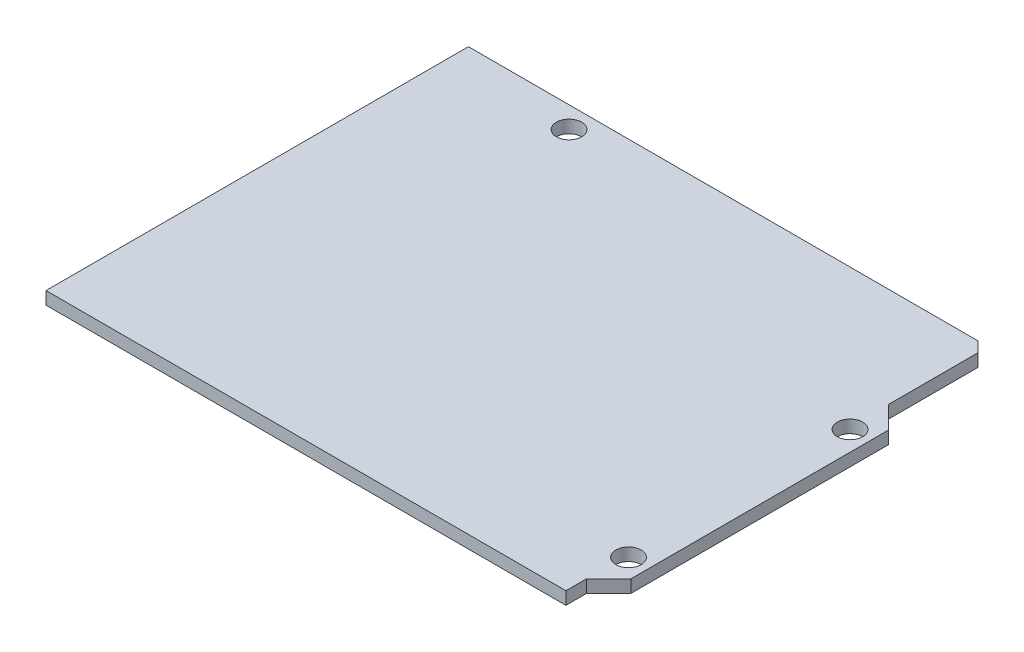
ISO-10303-21;
HEADER;
FILE_DESCRIPTION(('STEP AP214'),'2;1');
FILE_NAME('part.step','',(''),(''),'','','');
FILE_SCHEMA(('AUTOMOTIVE_DESIGN { 1 0 10303 214 1 1 1 1 }'));
ENDSEC;
DATA;
#1=APPLICATION_CONTEXT('core data for automotive mechanical design processes');
#2=APPLICATION_PROTOCOL_DEFINITION('international standard','automotive_design',2000,#1);
#3=PRODUCT_CONTEXT('',#1,'mechanical');
#4=PRODUCT('Part','Part','',(#3));
#5=PRODUCT_RELATED_PRODUCT_CATEGORY('part','',(#4));
#6=PRODUCT_DEFINITION_FORMATION('','',#4);
#7=PRODUCT_DEFINITION_CONTEXT('part definition',#1,'design');
#8=PRODUCT_DEFINITION('design','',#6,#7);
#9=PRODUCT_DEFINITION_SHAPE('','',#8);
#10=(LENGTH_UNIT() NAMED_UNIT(*) SI_UNIT(.MILLI.,.METRE.));
#11=(NAMED_UNIT(*) PLANE_ANGLE_UNIT() SI_UNIT($,.RADIAN.));
#12=(NAMED_UNIT(*) SI_UNIT($,.STERADIAN.) SOLID_ANGLE_UNIT());
#13=UNCERTAINTY_MEASURE_WITH_UNIT(LENGTH_MEASURE(1.E-05),#10,'distance_accuracy_value','');
#14=(GEOMETRIC_REPRESENTATION_CONTEXT(3) GLOBAL_UNCERTAINTY_ASSIGNED_CONTEXT((#13)) GLOBAL_UNIT_ASSIGNED_CONTEXT((#10,
#11,#12)) REPRESENTATION_CONTEXT('',''));
#15=CARTESIAN_POINT('',(0.,0.,0.));
#16=DIRECTION('',(0.,0.,1.));
#17=DIRECTION('',(1.,0.,0.));
#18=AXIS2_PLACEMENT_3D('',#15,#16,#17);
#19=CARTESIAN_POINT('',(0.,1.6,0.));
#20=DIRECTION('',(0.,-1.,0.));
#21=DIRECTION('',(0.,0.,-1.));
#22=AXIS2_PLACEMENT_3D('',#19,#20,#21);
#23=PLANE('',#22);
#24=DIRECTION('',(0.,0.,1.));
#25=VECTOR('',#24,1.);
#26=CARTESIAN_POINT('',(0.,1.6,0.));
#27=LINE('',#26,#25);
#28=CARTESIAN_POINT('',(0.,1.6,-53.3));
#29=VERTEX_POINT('',#28);
#30=CARTESIAN_POINT('',(0.,1.6,0.));
#31=VERTEX_POINT('',#30);
#32=EDGE_CURVE('E164',#29,#31,#27,.T.);
#33=ORIENTED_EDGE('',*,*,#32,.T.);
#34=DIRECTION('',(1.,0.,0.));
#35=VECTOR('',#34,1.);
#36=CARTESIAN_POINT('',(0.,1.6,0.));
#37=LINE('',#36,#35);
#38=CARTESIAN_POINT('',(65.6,1.6,0.));
#39=VERTEX_POINT('',#38);
#40=EDGE_CURVE('E103',#31,#39,#37,.T.);
#41=ORIENTED_EDGE('',*,*,#40,.T.);
#42=DIRECTION('',(0.,0.,-1.));
#43=VECTOR('',#42,1.);
#44=CARTESIAN_POINT('',(65.6,1.6,0.));
#45=LINE('',#44,#43);
#46=CARTESIAN_POINT('',(65.6,1.6,-2.6));
#47=VERTEX_POINT('',#46);
#48=EDGE_CURVE('E183',#39,#47,#45,.T.);
#49=ORIENTED_EDGE('',*,*,#48,.T.);
#50=DIRECTION('',(0.707106781186549,0.,-0.707106781186546));
#51=VECTOR('',#50,1.);
#52=CARTESIAN_POINT('',(65.6,1.6,-2.6));
#53=LINE('',#52,#51);
#54=CARTESIAN_POINT('',(68.4,1.6,-5.39999999999999));
#55=VERTEX_POINT('',#54);
#56=EDGE_CURVE('E201',#47,#55,#53,.T.);
#57=ORIENTED_EDGE('',*,*,#56,.T.);
#58=DIRECTION('',(0.,0.,-1.));
#59=VECTOR('',#58,1.);
#60=CARTESIAN_POINT('',(68.4,1.6,-5.39999999999999));
#61=LINE('',#60,#59);
#62=CARTESIAN_POINT('',(68.4,1.6,-37.9));
#63=VERTEX_POINT('',#62);
#64=EDGE_CURVE('E199',#55,#63,#61,.T.);
#65=ORIENTED_EDGE('',*,*,#64,.T.);
#66=DIRECTION('',(-0.707106781186551,0.,-0.707106781186544));
#67=VECTOR('',#66,1.);
#68=CARTESIAN_POINT('',(68.4,1.6,-37.9));
#69=LINE('',#68,#67);
#70=CARTESIAN_POINT('',(65.6,1.6,-40.7));
#71=VERTEX_POINT('',#70);
#72=EDGE_CURVE('E125',#63,#71,#69,.T.);
#73=ORIENTED_EDGE('',*,*,#72,.T.);
#74=DIRECTION('',(0.,0.,-1.));
#75=VECTOR('',#74,1.);
#76=CARTESIAN_POINT('',(65.6,1.6,-40.7));
#77=LINE('',#76,#75);
#78=CARTESIAN_POINT('',(65.6,1.6,-52.));
#79=VERTEX_POINT('',#78);
#80=EDGE_CURVE('E119',#71,#79,#77,.T.);
#81=ORIENTED_EDGE('',*,*,#80,.T.);
#82=DIRECTION('',(-0.707106781186551,0.,-0.707106781186544));
#83=VECTOR('',#82,1.);
#84=CARTESIAN_POINT('',(65.6,1.6,-52.));
#85=LINE('',#84,#83);
#86=CARTESIAN_POINT('',(64.3,1.6,-53.3));
#87=VERTEX_POINT('',#86);
#88=EDGE_CURVE('E123',#79,#87,#85,.T.);
#89=ORIENTED_EDGE('',*,*,#88,.T.);
#90=DIRECTION('',(-1.,0.,0.));
#91=VECTOR('',#90,1.);
#92=CARTESIAN_POINT('',(0.,1.6,-53.3));
#93=LINE('',#92,#91);
#94=EDGE_CURVE('E57',#87,#29,#93,.T.);
#95=ORIENTED_EDGE('',*,*,#94,.T.);
#96=EDGE_LOOP('',(#33,#41,#49,#57,#65,#73,#81,#89,#95));
#97=FACE_BOUND('',#96,.T.);
#98=CARTESIAN_POINT('',(65.9,1.6,-7.6));
#99=DIRECTION('',(0.,1.,0.));
#100=DIRECTION('',(0.,0.,1.));
#101=AXIS2_PLACEMENT_3D('',#98,#99,#100);
#102=CIRCLE('',#101,1.60000000000001);
#103=CARTESIAN_POINT('',(65.9,1.6,-5.99999999999999));
#104=VERTEX_POINT('',#103);
#105=EDGE_CURVE('E149',#104,#104,#102,.T.);
#106=ORIENTED_EDGE('',*,*,#105,.F.);
#107=EDGE_LOOP('',(#106));
#108=FACE_BOUND('',#107,.T.);
#109=CARTESIAN_POINT('',(65.9,1.6,-35.55));
#110=DIRECTION('',(0.,1.,0.));
#111=DIRECTION('',(0.,0.,1.));
#112=AXIS2_PLACEMENT_3D('',#109,#110,#111);
#113=CIRCLE('',#112,1.60000000000001);
#114=CARTESIAN_POINT('',(65.9,1.6,-33.95));
#115=VERTEX_POINT('',#114);
#116=EDGE_CURVE('E212',#115,#115,#113,.T.);
#117=ORIENTED_EDGE('',*,*,#116,.F.);
#118=EDGE_LOOP('',(#117));
#119=FACE_BOUND('',#118,.T.);
#120=CARTESIAN_POINT('',(15.4,1.6,-50.6));
#121=DIRECTION('',(0.,1.,0.));
#122=DIRECTION('',(0.,0.,1.));
#123=AXIS2_PLACEMENT_3D('',#120,#121,#122);
#124=CIRCLE('',#123,1.6);
#125=CARTESIAN_POINT('',(15.4,1.6,-49.));
#126=VERTEX_POINT('',#125);
#127=EDGE_CURVE('E219',#126,#126,#124,.T.);
#128=ORIENTED_EDGE('',*,*,#127,.F.);
#129=EDGE_LOOP('',(#128));
#130=FACE_BOUND('',#129,.T.);
#131=ADVANCED_FACE('F38',(#97,#108,#119,#130),#23,.F.);
#132=CARTESIAN_POINT('',(0.,0.,0.));
#133=DIRECTION('',(0.,-1.,0.));
#134=DIRECTION('',(0.,0.,-1.));
#135=AXIS2_PLACEMENT_3D('',#132,#133,#134);
#136=PLANE('',#135);
#137=CARTESIAN_POINT('',(65.9,0.,-35.55));
#138=DIRECTION('',(0.,1.,0.));
#139=DIRECTION('',(0.,0.,1.));
#140=AXIS2_PLACEMENT_3D('',#137,#138,#139);
#141=CIRCLE('',#140,1.60000000000001);
#142=CARTESIAN_POINT('',(65.9,0.,-33.95));
#143=VERTEX_POINT('',#142);
#144=EDGE_CURVE('E215',#143,#143,#141,.T.);
#145=ORIENTED_EDGE('',*,*,#144,.T.);
#146=EDGE_LOOP('',(#145));
#147=FACE_BOUND('',#146,.T.);
#148=DIRECTION('',(0.,0.,1.));
#149=VECTOR('',#148,1.);
#150=CARTESIAN_POINT('',(0.,0.,0.));
#151=LINE('',#150,#149);
#152=CARTESIAN_POINT('',(0.,0.,-53.3));
#153=VERTEX_POINT('',#152);
#154=CARTESIAN_POINT('',(0.,0.,0.));
#155=VERTEX_POINT('',#154);
#156=EDGE_CURVE('E144',#153,#155,#151,.T.);
#157=ORIENTED_EDGE('',*,*,#156,.F.);
#158=DIRECTION('',(-1.,0.,0.));
#159=VECTOR('',#158,1.);
#160=CARTESIAN_POINT('',(0.,0.,-53.3));
#161=LINE('',#160,#159);
#162=CARTESIAN_POINT('',(64.3,0.,-53.3));
#163=VERTEX_POINT('',#162);
#164=EDGE_CURVE('E95',#163,#153,#161,.T.);
#165=ORIENTED_EDGE('',*,*,#164,.F.);
#166=DIRECTION('',(-0.707106781186551,0.,-0.707106781186544));
#167=VECTOR('',#166,1.);
#168=CARTESIAN_POINT('',(65.6,0.,-52.));
#169=LINE('',#168,#167);
#170=CARTESIAN_POINT('',(65.6,0.,-52.));
#171=VERTEX_POINT('',#170);
#172=EDGE_CURVE('E89',#171,#163,#169,.T.);
#173=ORIENTED_EDGE('',*,*,#172,.F.);
#174=DIRECTION('',(0.,0.,-1.));
#175=VECTOR('',#174,1.);
#176=CARTESIAN_POINT('',(65.6,0.,-40.7));
#177=LINE('',#176,#175);
#178=CARTESIAN_POINT('',(65.6,0.,-40.7));
#179=VERTEX_POINT('',#178);
#180=EDGE_CURVE('E133',#179,#171,#177,.T.);
#181=ORIENTED_EDGE('',*,*,#180,.F.);
#182=DIRECTION('',(-0.707106781186551,0.,-0.707106781186544));
#183=VECTOR('',#182,1.);
#184=CARTESIAN_POINT('',(68.4,0.,-37.9));
#185=LINE('',#184,#183);
#186=CARTESIAN_POINT('',(68.4,0.,-37.9));
#187=VERTEX_POINT('',#186);
#188=EDGE_CURVE('E158',#187,#179,#185,.T.);
#189=ORIENTED_EDGE('',*,*,#188,.F.);
#190=DIRECTION('',(0.,0.,-1.));
#191=VECTOR('',#190,1.);
#192=CARTESIAN_POINT('',(68.4,0.,-5.39999999999999));
#193=LINE('',#192,#191);
#194=CARTESIAN_POINT('',(68.4,0.,-5.39999999999999));
#195=VERTEX_POINT('',#194);
#196=EDGE_CURVE('E155',#195,#187,#193,.T.);
#197=ORIENTED_EDGE('',*,*,#196,.F.);
#198=DIRECTION('',(0.707106781186549,0.,-0.707106781186546));
#199=VECTOR('',#198,1.);
#200=CARTESIAN_POINT('',(65.6,0.,-2.6));
#201=LINE('',#200,#199);
#202=CARTESIAN_POINT('',(65.6,0.,-2.6));
#203=VERTEX_POINT('',#202);
#204=EDGE_CURVE('E153',#203,#195,#201,.T.);
#205=ORIENTED_EDGE('',*,*,#204,.F.);
#206=DIRECTION('',(0.,0.,-1.));
#207=VECTOR('',#206,1.);
#208=CARTESIAN_POINT('',(65.6,0.,0.));
#209=LINE('',#208,#207);
#210=CARTESIAN_POINT('',(65.6,0.,0.));
#211=VERTEX_POINT('',#210);
#212=EDGE_CURVE('E151',#211,#203,#209,.T.);
#213=ORIENTED_EDGE('',*,*,#212,.F.);
#214=DIRECTION('',(1.,0.,0.));
#215=VECTOR('',#214,1.);
#216=CARTESIAN_POINT('',(0.,0.,0.));
#217=LINE('',#216,#215);
#218=EDGE_CURVE('E148',#155,#211,#217,.T.);
#219=ORIENTED_EDGE('',*,*,#218,.F.);
#220=EDGE_LOOP('',(#157,#165,#173,#181,#189,#197,#205,#213,#219));
#221=FACE_BOUND('',#220,.T.);
#222=CARTESIAN_POINT('',(65.9,0.,-7.6));
#223=DIRECTION('',(0.,1.,0.));
#224=DIRECTION('',(0.,0.,1.));
#225=AXIS2_PLACEMENT_3D('',#222,#223,#224);
#226=CIRCLE('',#225,1.60000000000001);
#227=CARTESIAN_POINT('',(65.9,0.,-5.99999999999999));
#228=VERTEX_POINT('',#227);
#229=EDGE_CURVE('E209',#228,#228,#226,.T.);
#230=ORIENTED_EDGE('',*,*,#229,.T.);
#231=EDGE_LOOP('',(#230));
#232=FACE_BOUND('',#231,.T.);
#233=CARTESIAN_POINT('',(15.4,0.,-50.6));
#234=DIRECTION('',(0.,1.,0.));
#235=DIRECTION('',(0.,0.,1.));
#236=AXIS2_PLACEMENT_3D('',#233,#234,#235);
#237=CIRCLE('',#236,1.6);
#238=CARTESIAN_POINT('',(15.4,0.,-49.));
#239=VERTEX_POINT('',#238);
#240=EDGE_CURVE('E222',#239,#239,#237,.T.);
#241=ORIENTED_EDGE('',*,*,#240,.T.);
#242=EDGE_LOOP('',(#241));
#243=FACE_BOUND('',#242,.T.);
#244=ADVANCED_FACE('F187',(#147,#221,#232,#243),#136,.T.);
#245=CARTESIAN_POINT('',(0.,1.6,0.));
#246=DIRECTION('',(1.,0.,0.));
#247=DIRECTION('',(0.,0.,-1.));
#248=AXIS2_PLACEMENT_3D('',#245,#246,#247);
#249=PLANE('',#248);
#250=ORIENTED_EDGE('',*,*,#156,.T.);
#251=DIRECTION('',(0.,-1.,0.));
#252=VECTOR('',#251,1.);
#253=CARTESIAN_POINT('',(0.,1.6,0.));
#254=LINE('',#253,#252);
#255=EDGE_CURVE('E11',#31,#155,#254,.T.);
#256=ORIENTED_EDGE('',*,*,#255,.F.);
#257=ORIENTED_EDGE('',*,*,#32,.F.);
#258=DIRECTION('',(0.,-1.,0.));
#259=VECTOR('',#258,1.);
#260=CARTESIAN_POINT('',(0.,1.6,-53.3));
#261=LINE('',#260,#259);
#262=EDGE_CURVE('E140',#29,#153,#261,.T.);
#263=ORIENTED_EDGE('',*,*,#262,.T.);
#264=EDGE_LOOP('',(#250,#256,#257,#263));
#265=FACE_BOUND('',#264,.T.);
#266=ADVANCED_FACE('F40',(#265),#249,.F.);
#267=CARTESIAN_POINT('',(0.,1.6,0.));
#268=DIRECTION('',(0.,0.,-1.));
#269=DIRECTION('',(-1.,0.,0.));
#270=AXIS2_PLACEMENT_3D('',#267,#268,#269);
#271=PLANE('',#270);
#272=ORIENTED_EDGE('',*,*,#218,.T.);
#273=DIRECTION('',(0.,-1.,0.));
#274=VECTOR('',#273,1.);
#275=CARTESIAN_POINT('',(65.6,1.6,0.));
#276=LINE('',#275,#274);
#277=EDGE_CURVE('E47',#39,#211,#276,.T.);
#278=ORIENTED_EDGE('',*,*,#277,.F.);
#279=ORIENTED_EDGE('',*,*,#40,.F.);
#280=ORIENTED_EDGE('',*,*,#255,.T.);
#281=EDGE_LOOP('',(#272,#278,#279,#280));
#282=FACE_BOUND('',#281,.T.);
#283=ADVANCED_FACE('F258',(#282),#271,.F.);
#284=CARTESIAN_POINT('',(65.6,1.6,0.));
#285=DIRECTION('',(-1.,0.,0.));
#286=DIRECTION('',(0.,0.,1.));
#287=AXIS2_PLACEMENT_3D('',#284,#285,#286);
#288=PLANE('',#287);
#289=ORIENTED_EDGE('',*,*,#212,.T.);
#290=DIRECTION('',(0.,-1.,0.));
#291=VECTOR('',#290,1.);
#292=CARTESIAN_POINT('',(65.6,1.6,-2.6));
#293=LINE('',#292,#291);
#294=EDGE_CURVE('E175',#47,#203,#293,.T.);
#295=ORIENTED_EDGE('',*,*,#294,.F.);
#296=ORIENTED_EDGE('',*,*,#48,.F.);
#297=ORIENTED_EDGE('',*,*,#277,.T.);
#298=EDGE_LOOP('',(#289,#295,#296,#297));
#299=FACE_BOUND('',#298,.T.);
#300=ADVANCED_FACE('F181',(#299),#288,.F.);
#301=CARTESIAN_POINT('',(65.6,1.6,-2.6));
#302=DIRECTION('',(-0.707106781186546,0.,-0.707106781186549));
#303=DIRECTION('',(-0.707106781186549,0.,0.707106781186546));
#304=AXIS2_PLACEMENT_3D('',#301,#302,#303);
#305=PLANE('',#304);
#306=ORIENTED_EDGE('',*,*,#204,.T.);
#307=DIRECTION('',(0.,-1.,0.));
#308=VECTOR('',#307,1.);
#309=CARTESIAN_POINT('',(68.4,1.6,-5.39999999999999));
#310=LINE('',#309,#308);
#311=EDGE_CURVE('E172',#55,#195,#310,.T.);
#312=ORIENTED_EDGE('',*,*,#311,.F.);
#313=ORIENTED_EDGE('',*,*,#56,.F.);
#314=ORIENTED_EDGE('',*,*,#294,.T.);
#315=EDGE_LOOP('',(#306,#312,#313,#314));
#316=FACE_BOUND('',#315,.T.);
#317=ADVANCED_FACE('F193',(#316),#305,.F.);
#318=CARTESIAN_POINT('',(68.4,1.6,-5.39999999999999));
#319=DIRECTION('',(-1.,0.,0.));
#320=DIRECTION('',(0.,0.,1.));
#321=AXIS2_PLACEMENT_3D('',#318,#319,#320);
#322=PLANE('',#321);
#323=ORIENTED_EDGE('',*,*,#196,.T.);
#324=DIRECTION('',(0.,-1.,0.));
#325=VECTOR('',#324,1.);
#326=CARTESIAN_POINT('',(68.4,1.6,-37.9));
#327=LINE('',#326,#325);
#328=EDGE_CURVE('E169',#63,#187,#327,.T.);
#329=ORIENTED_EDGE('',*,*,#328,.F.);
#330=ORIENTED_EDGE('',*,*,#64,.F.);
#331=ORIENTED_EDGE('',*,*,#311,.T.);
#332=EDGE_LOOP('',(#323,#329,#330,#331));
#333=FACE_BOUND('',#332,.T.);
#334=ADVANCED_FACE('F197',(#333),#322,.F.);
#335=CARTESIAN_POINT('',(68.4,1.6,-37.9));
#336=DIRECTION('',(-0.707106781186544,0.,0.707106781186551));
#337=DIRECTION('',(0.707106781186551,0.,0.707106781186544));
#338=AXIS2_PLACEMENT_3D('',#335,#336,#337);
#339=PLANE('',#338);
#340=ORIENTED_EDGE('',*,*,#188,.T.);
#341=DIRECTION('',(0.,-1.,0.));
#342=VECTOR('',#341,1.);
#343=CARTESIAN_POINT('',(65.6,1.6,-40.7));
#344=LINE('',#343,#342);
#345=EDGE_CURVE('E134',#71,#179,#344,.T.);
#346=ORIENTED_EDGE('',*,*,#345,.F.);
#347=ORIENTED_EDGE('',*,*,#72,.F.);
#348=ORIENTED_EDGE('',*,*,#328,.T.);
#349=EDGE_LOOP('',(#340,#346,#347,#348));
#350=FACE_BOUND('',#349,.T.);
#351=ADVANCED_FACE('F249',(#350),#339,.F.);
#352=CARTESIAN_POINT('',(65.6,1.6,-40.7));
#353=DIRECTION('',(-1.,0.,0.));
#354=DIRECTION('',(0.,0.,1.));
#355=AXIS2_PLACEMENT_3D('',#352,#353,#354);
#356=PLANE('',#355);
#357=ORIENTED_EDGE('',*,*,#180,.T.);
#358=DIRECTION('',(0.,-1.,0.));
#359=VECTOR('',#358,1.);
#360=CARTESIAN_POINT('',(65.6,1.6,-52.));
#361=LINE('',#360,#359);
#362=EDGE_CURVE('E130',#79,#171,#361,.T.);
#363=ORIENTED_EDGE('',*,*,#362,.F.);
#364=ORIENTED_EDGE('',*,*,#80,.F.);
#365=ORIENTED_EDGE('',*,*,#345,.T.);
#366=EDGE_LOOP('',(#357,#363,#364,#365));
#367=FACE_BOUND('',#366,.T.);
#368=ADVANCED_FACE('F131',(#367),#356,.F.);
#369=CARTESIAN_POINT('',(65.6,1.6,-52.));
#370=DIRECTION('',(-0.707106781186544,0.,0.707106781186551));
#371=DIRECTION('',(0.707106781186551,0.,0.707106781186544));
#372=AXIS2_PLACEMENT_3D('',#369,#370,#371);
#373=PLANE('',#372);
#374=ORIENTED_EDGE('',*,*,#172,.T.);
#375=DIRECTION('',(0.,-1.,0.));
#376=VECTOR('',#375,1.);
#377=CARTESIAN_POINT('',(64.3,1.6,-53.3));
#378=LINE('',#377,#376);
#379=EDGE_CURVE('E135',#87,#163,#378,.T.);
#380=ORIENTED_EDGE('',*,*,#379,.F.);
#381=ORIENTED_EDGE('',*,*,#88,.F.);
#382=ORIENTED_EDGE('',*,*,#362,.T.);
#383=EDGE_LOOP('',(#374,#380,#381,#382));
#384=FACE_BOUND('',#383,.T.);
#385=ADVANCED_FACE('F137',(#384),#373,.F.);
#386=CARTESIAN_POINT('',(0.,1.6,-53.3));
#387=DIRECTION('',(0.,0.,1.));
#388=DIRECTION('',(1.,0.,0.));
#389=AXIS2_PLACEMENT_3D('',#386,#387,#388);
#390=PLANE('',#389);
#391=ORIENTED_EDGE('',*,*,#164,.T.);
#392=ORIENTED_EDGE('',*,*,#262,.F.);
#393=ORIENTED_EDGE('',*,*,#94,.F.);
#394=ORIENTED_EDGE('',*,*,#379,.T.);
#395=EDGE_LOOP('',(#391,#392,#393,#394));
#396=FACE_BOUND('',#395,.T.);
#397=ADVANCED_FACE('F242',(#396),#390,.F.);
#398=CARTESIAN_POINT('',(65.9,1.6,-7.6));
#399=DIRECTION('',(0.,-1.,0.));
#400=DIRECTION('',(0.,0.,-1.));
#401=AXIS2_PLACEMENT_3D('',#398,#399,#400);
#402=CYLINDRICAL_SURFACE('',#401,1.60000000000001);
#403=ORIENTED_EDGE('',*,*,#105,.T.);
#404=EDGE_LOOP('',(#403));
#405=FACE_BOUND('',#404,.T.);
#406=ORIENTED_EDGE('',*,*,#229,.F.);
#407=EDGE_LOOP('',(#406));
#408=FACE_BOUND('',#407,.T.);
#409=ADVANCED_FACE('F239',(#405,#408),#402,.F.);
#410=CARTESIAN_POINT('',(65.9,1.6,-35.55));
#411=DIRECTION('',(0.,-1.,0.));
#412=DIRECTION('',(0.,0.,-1.));
#413=AXIS2_PLACEMENT_3D('',#410,#411,#412);
#414=CYLINDRICAL_SURFACE('',#413,1.60000000000001);
#415=ORIENTED_EDGE('',*,*,#116,.T.);
#416=EDGE_LOOP('',(#415));
#417=FACE_BOUND('',#416,.T.);
#418=ORIENTED_EDGE('',*,*,#144,.F.);
#419=EDGE_LOOP('',(#418));
#420=FACE_BOUND('',#419,.T.);
#421=ADVANCED_FACE('F329',(#417,#420),#414,.F.);
#422=CARTESIAN_POINT('',(15.4,1.6,-50.6));
#423=DIRECTION('',(0.,-1.,0.));
#424=DIRECTION('',(0.,0.,-1.));
#425=AXIS2_PLACEMENT_3D('',#422,#423,#424);
#426=CYLINDRICAL_SURFACE('',#425,1.6);
#427=ORIENTED_EDGE('',*,*,#127,.T.);
#428=EDGE_LOOP('',(#427));
#429=FACE_BOUND('',#428,.T.);
#430=ORIENTED_EDGE('',*,*,#240,.F.);
#431=EDGE_LOOP('',(#430));
#432=FACE_BOUND('',#431,.T.);
#433=ADVANCED_FACE('F228',(#429,#432),#426,.F.);
#434=CLOSED_SHELL('',(#131,#244,#266,#283,#300,#317,#334,#351,#368,#385,#397,#409,#421,#433));
#435=MANIFOLD_SOLID_BREP('B2',#434);
#436=ADVANCED_BREP_SHAPE_REPRESENTATION('',(#18,#435),#14);
#437=SHAPE_DEFINITION_REPRESENTATION(#9,#436);
ENDSEC;
END-ISO-10303-21;
